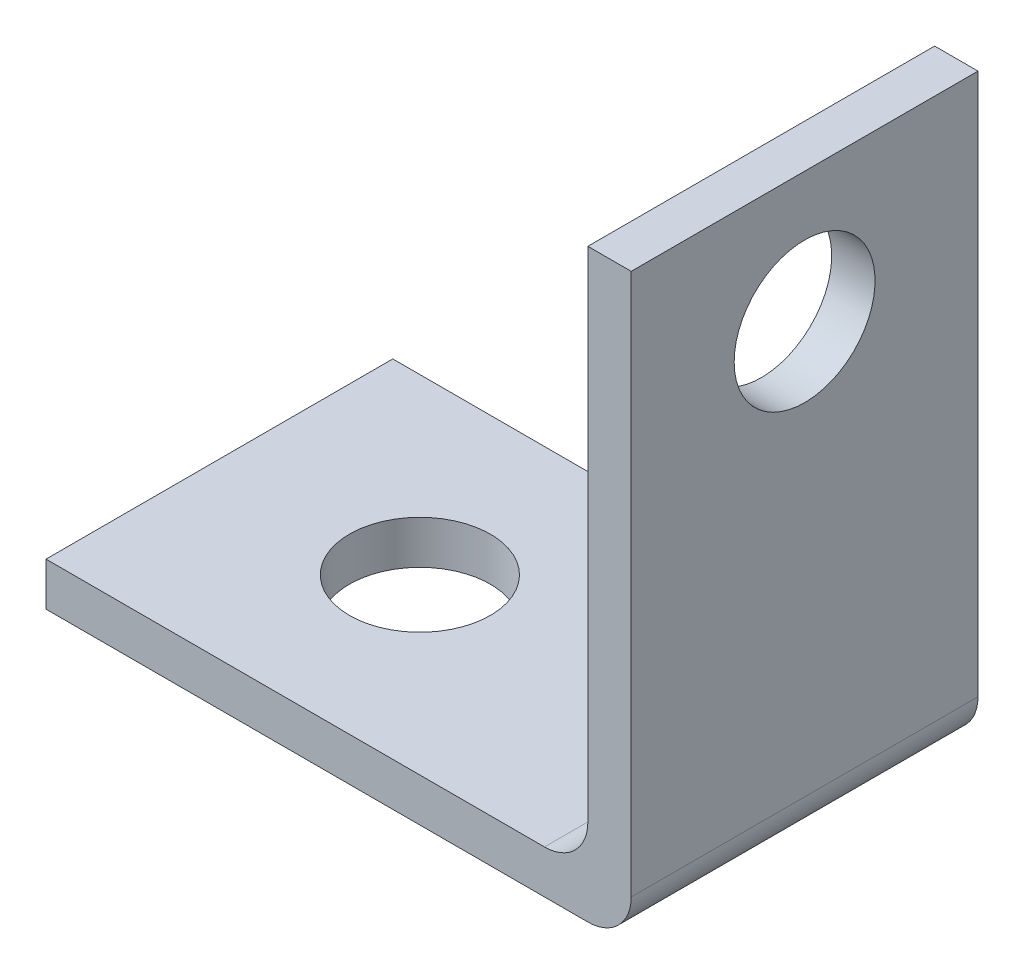
ISO-10303-21;
HEADER;
FILE_DESCRIPTION(('STEP AP214'),'2;1');
FILE_NAME('part.step','',(''),(''),'','','');
FILE_SCHEMA(('AUTOMOTIVE_DESIGN { 1 0 10303 214 1 1 1 1 }'));
ENDSEC;
DATA;
#1=APPLICATION_CONTEXT('core data for automotive mechanical design processes');
#2=APPLICATION_PROTOCOL_DEFINITION('international standard','automotive_design',2000,#1);
#3=PRODUCT_CONTEXT('',#1,'mechanical');
#4=PRODUCT('Part','Part','',(#3));
#5=PRODUCT_RELATED_PRODUCT_CATEGORY('part','',(#4));
#6=PRODUCT_DEFINITION_FORMATION('','',#4);
#7=PRODUCT_DEFINITION_CONTEXT('part definition',#1,'design');
#8=PRODUCT_DEFINITION('design','',#6,#7);
#9=PRODUCT_DEFINITION_SHAPE('','',#8);
#10=(LENGTH_UNIT() NAMED_UNIT(*) SI_UNIT(.MILLI.,.METRE.));
#11=(NAMED_UNIT(*) PLANE_ANGLE_UNIT() SI_UNIT($,.RADIAN.));
#12=(NAMED_UNIT(*) SI_UNIT($,.STERADIAN.) SOLID_ANGLE_UNIT());
#13=UNCERTAINTY_MEASURE_WITH_UNIT(LENGTH_MEASURE(1.E-05),#10,'distance_accuracy_value','');
#14=(GEOMETRIC_REPRESENTATION_CONTEXT(3) GLOBAL_UNCERTAINTY_ASSIGNED_CONTEXT((#13)) GLOBAL_UNIT_ASSIGNED_CONTEXT((#10,
#11,#12)) REPRESENTATION_CONTEXT('',''));
#15=CARTESIAN_POINT('',(0.,0.,0.));
#16=DIRECTION('',(0.,0.,1.));
#17=DIRECTION('',(1.,0.,0.));
#18=AXIS2_PLACEMENT_3D('',#15,#16,#17);
#19=CARTESIAN_POINT('',(25.,1.,-8.));
#20=DIRECTION('',(0.,0.,1.));
#21=DIRECTION('',(1.,0.,0.));
#22=AXIS2_PLACEMENT_3D('',#19,#20,#21);
#23=PLANE('',#22);
#24=DIRECTION('',(0.,1.,0.));
#25=VECTOR('',#24,1.);
#26=CARTESIAN_POINT('',(27.,-1.,-8.));
#27=LINE('',#26,#25);
#28=CARTESIAN_POINT('',(27.,1.,-8.));
#29=VERTEX_POINT('',#28);
#30=CARTESIAN_POINT('',(27.,26.,-8.));
#31=VERTEX_POINT('',#30);
#32=EDGE_CURVE('E96',#29,#31,#27,.T.);
#33=ORIENTED_EDGE('',*,*,#32,.F.);
#34=CARTESIAN_POINT('',(25.,1.,-8.));
#35=DIRECTION('',(0.,0.,1.));
#36=DIRECTION('',(1.,0.,0.));
#37=AXIS2_PLACEMENT_3D('',#34,#35,#36);
#38=CIRCLE('',#37,2.);
#39=CARTESIAN_POINT('',(25.,-1.,-8.));
#40=VERTEX_POINT('',#39);
#41=EDGE_CURVE('E151',#29,#40,#38,.F.);
#42=ORIENTED_EDGE('',*,*,#41,.T.);
#43=DIRECTION('',(-1.,0.,0.));
#44=VECTOR('',#43,1.);
#45=CARTESIAN_POINT('',(25.,-1.,-8.));
#46=LINE('',#45,#44);
#47=CARTESIAN_POINT('',(0.,-1.,-8.));
#48=VERTEX_POINT('',#47);
#49=EDGE_CURVE('E142',#40,#48,#46,.T.);
#50=ORIENTED_EDGE('',*,*,#49,.T.);
#51=DIRECTION('',(0.,1.,0.));
#52=VECTOR('',#51,1.);
#53=CARTESIAN_POINT('',(0.,1.,-8.));
#54=LINE('',#53,#52);
#55=CARTESIAN_POINT('',(0.,1.,-8.));
#56=VERTEX_POINT('',#55);
#57=EDGE_CURVE('E114',#48,#56,#54,.T.);
#58=ORIENTED_EDGE('',*,*,#57,.T.);
#59=DIRECTION('',(-1.,0.,0.));
#60=VECTOR('',#59,1.);
#61=CARTESIAN_POINT('',(25.,1.,-8.));
#62=LINE('',#61,#60);
#63=CARTESIAN_POINT('',(23.,1.,-8.));
#64=VERTEX_POINT('',#63);
#65=EDGE_CURVE('E148',#64,#56,#62,.T.);
#66=ORIENTED_EDGE('',*,*,#65,.F.);
#67=CARTESIAN_POINT('',(23.,3.,-8.));
#68=DIRECTION('',(0.,0.,1.));
#69=DIRECTION('',(1.,0.,0.));
#70=AXIS2_PLACEMENT_3D('',#67,#68,#69);
#71=CIRCLE('',#70,2.);
#72=CARTESIAN_POINT('',(25.,3.,-8.));
#73=VERTEX_POINT('',#72);
#74=EDGE_CURVE('E11',#64,#73,#71,.T.);
#75=ORIENTED_EDGE('',*,*,#74,.T.);
#76=DIRECTION('',(0.,1.,0.));
#77=VECTOR('',#76,1.);
#78=CARTESIAN_POINT('',(25.,-1.,-8.));
#79=LINE('',#78,#77);
#80=CARTESIAN_POINT('',(25.,26.,-8.));
#81=VERTEX_POINT('',#80);
#82=EDGE_CURVE('E111',#73,#81,#79,.T.);
#83=ORIENTED_EDGE('',*,*,#82,.T.);
#84=DIRECTION('',(-1.,0.,0.));
#85=VECTOR('',#84,1.);
#86=CARTESIAN_POINT('',(27.,26.,-8.));
#87=LINE('',#86,#85);
#88=EDGE_CURVE('E109',#31,#81,#87,.T.);
#89=ORIENTED_EDGE('',*,*,#88,.F.);
#90=EDGE_LOOP('',(#33,#42,#50,#58,#66,#75,#83,#89));
#91=FACE_BOUND('',#90,.T.);
#92=ADVANCED_FACE('F33',(#91),#23,.F.);
#93=CARTESIAN_POINT('',(25.,1.,8.));
#94=DIRECTION('',(0.,-1.,0.));
#95=DIRECTION('',(0.,0.,-1.));
#96=AXIS2_PLACEMENT_3D('',#93,#94,#95);
#97=PLANE('',#96);
#98=CARTESIAN_POINT('',(9.25,1.,0.));
#99=DIRECTION('',(0.,1.,0.));
#100=DIRECTION('',(0.,0.,1.));
#101=AXIS2_PLACEMENT_3D('',#98,#99,#100);
#102=CIRCLE('',#101,3.25);
#103=CARTESIAN_POINT('',(9.25,1.,3.25));
#104=VERTEX_POINT('',#103);
#105=EDGE_CURVE('E229',#104,#104,#102,.T.);
#106=ORIENTED_EDGE('',*,*,#105,.F.);
#107=EDGE_LOOP('',(#106));
#108=FACE_BOUND('',#107,.T.);
#109=DIRECTION('',(-1.,0.,0.));
#110=VECTOR('',#109,1.);
#111=CARTESIAN_POINT('',(25.,1.,8.));
#112=LINE('',#111,#110);
#113=CARTESIAN_POINT('',(23.,1.,8.));
#114=VERTEX_POINT('',#113);
#115=CARTESIAN_POINT('',(0.,1.,8.));
#116=VERTEX_POINT('',#115);
#117=EDGE_CURVE('E146',#114,#116,#112,.T.);
#118=ORIENTED_EDGE('',*,*,#117,.F.);
#119=DIRECTION('',(0.,0.,1.));
#120=VECTOR('',#119,1.);
#121=CARTESIAN_POINT('',(23.,1.,-8.));
#122=LINE('',#121,#120);
#123=EDGE_CURVE('E159',#114,#64,#122,.F.);
#124=ORIENTED_EDGE('',*,*,#123,.T.);
#125=ORIENTED_EDGE('',*,*,#65,.T.);
#126=DIRECTION('',(0.,0.,1.));
#127=VECTOR('',#126,1.);
#128=CARTESIAN_POINT('',(0.,1.,8.));
#129=LINE('',#128,#127);
#130=EDGE_CURVE('E133',#56,#116,#129,.T.);
#131=ORIENTED_EDGE('',*,*,#130,.T.);
#132=EDGE_LOOP('',(#118,#124,#125,#131));
#133=FACE_BOUND('',#132,.T.);
#134=ADVANCED_FACE('F162',(#108,#133),#97,.F.);
#135=CARTESIAN_POINT('',(25.,1.,8.));
#136=DIRECTION('',(0.,0.,-1.));
#137=DIRECTION('',(-1.,0.,0.));
#138=AXIS2_PLACEMENT_3D('',#135,#136,#137);
#139=PLANE('',#138);
#140=DIRECTION('',(-1.,0.,0.));
#141=VECTOR('',#140,1.);
#142=CARTESIAN_POINT('',(25.,-1.,8.));
#143=LINE('',#142,#141);
#144=CARTESIAN_POINT('',(25.,-1.,8.));
#145=VERTEX_POINT('',#144);
#146=CARTESIAN_POINT('',(0.,-1.,8.));
#147=VERTEX_POINT('',#146);
#148=EDGE_CURVE('E144',#145,#147,#143,.T.);
#149=ORIENTED_EDGE('',*,*,#148,.F.);
#150=CARTESIAN_POINT('',(25.,1.,8.));
#151=DIRECTION('',(0.,0.,-1.));
#152=DIRECTION('',(-1.,0.,0.));
#153=AXIS2_PLACEMENT_3D('',#150,#151,#152);
#154=CIRCLE('',#153,2.);
#155=CARTESIAN_POINT('',(27.,1.,8.));
#156=VERTEX_POINT('',#155);
#157=EDGE_CURVE('E155',#145,#156,#154,.F.);
#158=ORIENTED_EDGE('',*,*,#157,.T.);
#159=DIRECTION('',(0.,-1.,0.));
#160=VECTOR('',#159,1.);
#161=CARTESIAN_POINT('',(27.,-1.,8.));
#162=LINE('',#161,#160);
#163=CARTESIAN_POINT('',(27.,26.,8.));
#164=VERTEX_POINT('',#163);
#165=EDGE_CURVE('E120',#164,#156,#162,.T.);
#166=ORIENTED_EDGE('',*,*,#165,.F.);
#167=DIRECTION('',(-1.,0.,0.));
#168=VECTOR('',#167,1.);
#169=CARTESIAN_POINT('',(27.,26.,8.));
#170=LINE('',#169,#168);
#171=CARTESIAN_POINT('',(25.,26.,8.));
#172=VERTEX_POINT('',#171);
#173=EDGE_CURVE('E115',#164,#172,#170,.T.);
#174=ORIENTED_EDGE('',*,*,#173,.T.);
#175=DIRECTION('',(0.,-1.,0.));
#176=VECTOR('',#175,1.);
#177=CARTESIAN_POINT('',(25.,-1.,8.));
#178=LINE('',#177,#176);
#179=CARTESIAN_POINT('',(25.,3.,8.));
#180=VERTEX_POINT('',#179);
#181=EDGE_CURVE('E106',#172,#180,#178,.T.);
#182=ORIENTED_EDGE('',*,*,#181,.T.);
#183=CARTESIAN_POINT('',(23.,3.,8.));
#184=DIRECTION('',(0.,0.,-1.));
#185=DIRECTION('',(-1.,0.,0.));
#186=AXIS2_PLACEMENT_3D('',#183,#184,#185);
#187=CIRCLE('',#186,2.);
#188=EDGE_CURVE('E41',#180,#114,#187,.T.);
#189=ORIENTED_EDGE('',*,*,#188,.T.);
#190=ORIENTED_EDGE('',*,*,#117,.T.);
#191=DIRECTION('',(0.,-1.,0.));
#192=VECTOR('',#191,1.);
#193=CARTESIAN_POINT('',(0.,1.,8.));
#194=LINE('',#193,#192);
#195=EDGE_CURVE('E136',#116,#147,#194,.T.);
#196=ORIENTED_EDGE('',*,*,#195,.T.);
#197=EDGE_LOOP('',(#149,#158,#166,#174,#182,#189,#190,#196));
#198=FACE_BOUND('',#197,.T.);
#199=ADVANCED_FACE('F170',(#198),#139,.F.);
#200=CARTESIAN_POINT('',(25.,-1.,8.));
#201=DIRECTION('',(0.,1.,0.));
#202=DIRECTION('',(0.,0.,1.));
#203=AXIS2_PLACEMENT_3D('',#200,#201,#202);
#204=PLANE('',#203);
#205=CARTESIAN_POINT('',(9.25,-1.,0.));
#206=DIRECTION('',(0.,1.,0.));
#207=DIRECTION('',(0.,0.,1.));
#208=AXIS2_PLACEMENT_3D('',#205,#206,#207);
#209=CIRCLE('',#208,3.25);
#210=CARTESIAN_POINT('',(9.25,-1.,3.25));
#211=VERTEX_POINT('',#210);
#212=EDGE_CURVE('E127',#211,#211,#209,.T.);
#213=ORIENTED_EDGE('',*,*,#212,.T.);
#214=EDGE_LOOP('',(#213));
#215=FACE_BOUND('',#214,.T.);
#216=ORIENTED_EDGE('',*,*,#49,.F.);
#217=DIRECTION('',(0.,0.,-1.));
#218=VECTOR('',#217,1.);
#219=CARTESIAN_POINT('',(25.,-1.,8.));
#220=LINE('',#219,#218);
#221=EDGE_CURVE('E153',#40,#145,#220,.F.);
#222=ORIENTED_EDGE('',*,*,#221,.T.);
#223=ORIENTED_EDGE('',*,*,#148,.T.);
#224=DIRECTION('',(0.,0.,-1.));
#225=VECTOR('',#224,1.);
#226=CARTESIAN_POINT('',(0.,-1.,8.));
#227=LINE('',#226,#225);
#228=EDGE_CURVE('E139',#147,#48,#227,.T.);
#229=ORIENTED_EDGE('',*,*,#228,.T.);
#230=EDGE_LOOP('',(#216,#222,#223,#229));
#231=FACE_BOUND('',#230,.T.);
#232=ADVANCED_FACE('F177',(#215,#231),#204,.F.);
#233=CARTESIAN_POINT('',(0.,0.,0.));
#234=DIRECTION('',(1.,0.,0.));
#235=DIRECTION('',(0.,0.,-1.));
#236=AXIS2_PLACEMENT_3D('',#233,#234,#235);
#237=PLANE('',#236);
#238=ORIENTED_EDGE('',*,*,#57,.F.);
#239=ORIENTED_EDGE('',*,*,#228,.F.);
#240=ORIENTED_EDGE('',*,*,#195,.F.);
#241=ORIENTED_EDGE('',*,*,#130,.F.);
#242=EDGE_LOOP('',(#238,#239,#240,#241));
#243=FACE_BOUND('',#242,.T.);
#244=ADVANCED_FACE('F181',(#243),#237,.F.);
#245=CARTESIAN_POINT('',(25.,0.,0.));
#246=DIRECTION('',(1.,0.,0.));
#247=DIRECTION('',(0.,0.,-1.));
#248=AXIS2_PLACEMENT_3D('',#245,#246,#247);
#249=PLANE('',#248);
#250=CARTESIAN_POINT('',(25.,20.,0.));
#251=DIRECTION('',(-1.,0.,0.));
#252=DIRECTION('',(0.,0.,1.));
#253=AXIS2_PLACEMENT_3D('',#250,#251,#252);
#254=CIRCLE('',#253,3.25);
#255=CARTESIAN_POINT('',(25.,20.,3.25));
#256=VERTEX_POINT('',#255);
#257=EDGE_CURVE('E227',#256,#256,#254,.T.);
#258=ORIENTED_EDGE('',*,*,#257,.F.);
#259=EDGE_LOOP('',(#258));
#260=FACE_BOUND('',#259,.T.);
#261=ORIENTED_EDGE('',*,*,#82,.F.);
#262=DIRECTION('',(0.,0.,1.));
#263=VECTOR('',#262,1.);
#264=CARTESIAN_POINT('',(25.,3.,8.));
#265=LINE('',#264,#263);
#266=EDGE_CURVE('E157',#73,#180,#265,.T.);
#267=ORIENTED_EDGE('',*,*,#266,.T.);
#268=ORIENTED_EDGE('',*,*,#181,.F.);
#269=DIRECTION('',(0.,0.,1.));
#270=VECTOR('',#269,1.);
#271=CARTESIAN_POINT('',(25.,26.,8.));
#272=LINE('',#271,#270);
#273=EDGE_CURVE('E126',#81,#172,#272,.T.);
#274=ORIENTED_EDGE('',*,*,#273,.F.);
#275=EDGE_LOOP('',(#261,#267,#268,#274));
#276=FACE_BOUND('',#275,.T.);
#277=ADVANCED_FACE('F168',(#260,#276),#249,.F.);
#278=CARTESIAN_POINT('',(27.,26.,8.));
#279=DIRECTION('',(0.,-1.,0.));
#280=DIRECTION('',(0.,0.,-1.));
#281=AXIS2_PLACEMENT_3D('',#278,#279,#280);
#282=PLANE('',#281);
#283=ORIENTED_EDGE('',*,*,#273,.T.);
#284=ORIENTED_EDGE('',*,*,#173,.F.);
#285=DIRECTION('',(0.,0.,1.));
#286=VECTOR('',#285,1.);
#287=CARTESIAN_POINT('',(27.,26.,8.));
#288=LINE('',#287,#286);
#289=EDGE_CURVE('E101',#31,#164,#288,.T.);
#290=ORIENTED_EDGE('',*,*,#289,.F.);
#291=ORIENTED_EDGE('',*,*,#88,.T.);
#292=EDGE_LOOP('',(#283,#284,#290,#291));
#293=FACE_BOUND('',#292,.T.);
#294=ADVANCED_FACE('F117',(#293),#282,.F.);
#295=CARTESIAN_POINT('',(27.,0.,0.));
#296=DIRECTION('',(1.,0.,0.));
#297=DIRECTION('',(0.,0.,-1.));
#298=AXIS2_PLACEMENT_3D('',#295,#296,#297);
#299=PLANE('',#298);
#300=CARTESIAN_POINT('',(27.,20.,0.));
#301=DIRECTION('',(-1.,0.,0.));
#302=DIRECTION('',(0.,0.,1.));
#303=AXIS2_PLACEMENT_3D('',#300,#301,#302);
#304=CIRCLE('',#303,3.25);
#305=CARTESIAN_POINT('',(27.,20.,3.25));
#306=VERTEX_POINT('',#305);
#307=EDGE_CURVE('E224',#306,#306,#304,.T.);
#308=ORIENTED_EDGE('',*,*,#307,.T.);
#309=EDGE_LOOP('',(#308));
#310=FACE_BOUND('',#309,.T.);
#311=ORIENTED_EDGE('',*,*,#165,.T.);
#312=DIRECTION('',(0.,0.,-1.));
#313=VECTOR('',#312,1.);
#314=CARTESIAN_POINT('',(27.,1.,-8.));
#315=LINE('',#314,#313);
#316=EDGE_CURVE('E104',#156,#29,#315,.T.);
#317=ORIENTED_EDGE('',*,*,#316,.T.);
#318=ORIENTED_EDGE('',*,*,#32,.T.);
#319=ORIENTED_EDGE('',*,*,#289,.T.);
#320=EDGE_LOOP('',(#311,#317,#318,#319));
#321=FACE_BOUND('',#320,.T.);
#322=ADVANCED_FACE('F99',(#310,#321),#299,.T.);
#323=CARTESIAN_POINT('',(25.,1.,0.));
#324=DIRECTION('',(0.,0.,1.));
#325=DIRECTION('',(1.,0.,0.));
#326=AXIS2_PLACEMENT_3D('',#323,#324,#325);
#327=CYLINDRICAL_SURFACE('',#326,2.);
#328=ORIENTED_EDGE('',*,*,#157,.F.);
#329=ORIENTED_EDGE('',*,*,#221,.F.);
#330=ORIENTED_EDGE('',*,*,#41,.F.);
#331=ORIENTED_EDGE('',*,*,#316,.F.);
#332=EDGE_LOOP('',(#328,#329,#330,#331));
#333=FACE_BOUND('',#332,.T.);
#334=ADVANCED_FACE('F173',(#333),#327,.T.);
#335=CARTESIAN_POINT('',(23.,3.,0.));
#336=DIRECTION('',(0.,0.,-1.));
#337=DIRECTION('',(-1.,0.,0.));
#338=AXIS2_PLACEMENT_3D('',#335,#336,#337);
#339=CYLINDRICAL_SURFACE('',#338,2.);
#340=ORIENTED_EDGE('',*,*,#74,.F.);
#341=ORIENTED_EDGE('',*,*,#123,.F.);
#342=ORIENTED_EDGE('',*,*,#188,.F.);
#343=ORIENTED_EDGE('',*,*,#266,.F.);
#344=EDGE_LOOP('',(#340,#341,#342,#343));
#345=FACE_BOUND('',#344,.T.);
#346=ADVANCED_FACE('F35',(#345),#339,.F.);
#347=CARTESIAN_POINT('',(9.25,-1.,0.));
#348=DIRECTION('',(0.,1.,0.));
#349=DIRECTION('',(0.,0.,1.));
#350=AXIS2_PLACEMENT_3D('',#347,#348,#349);
#351=CYLINDRICAL_SURFACE('',#350,3.25);
#352=ORIENTED_EDGE('',*,*,#212,.F.);
#353=EDGE_LOOP('',(#352));
#354=FACE_BOUND('',#353,.T.);
#355=ORIENTED_EDGE('',*,*,#105,.T.);
#356=EDGE_LOOP('',(#355));
#357=FACE_BOUND('',#356,.T.);
#358=ADVANCED_FACE('F206',(#354,#357),#351,.F.);
#359=CARTESIAN_POINT('',(27.,20.,0.));
#360=DIRECTION('',(-1.,0.,0.));
#361=DIRECTION('',(0.,0.,1.));
#362=AXIS2_PLACEMENT_3D('',#359,#360,#361);
#363=CYLINDRICAL_SURFACE('',#362,3.25);
#364=ORIENTED_EDGE('',*,*,#307,.F.);
#365=EDGE_LOOP('',(#364));
#366=FACE_BOUND('',#365,.T.);
#367=ORIENTED_EDGE('',*,*,#257,.T.);
#368=EDGE_LOOP('',(#367));
#369=FACE_BOUND('',#368,.T.);
#370=ADVANCED_FACE('F216',(#366,#369),#363,.F.);
#371=CLOSED_SHELL('',(#92,#134,#199,#232,#244,#277,#294,#322,#334,#346,#358,#370));
#372=MANIFOLD_SOLID_BREP('B2',#371);
#373=ADVANCED_BREP_SHAPE_REPRESENTATION('',(#18,#372),#14);
#374=SHAPE_DEFINITION_REPRESENTATION(#9,#373);
ENDSEC;
END-ISO-10303-21;
